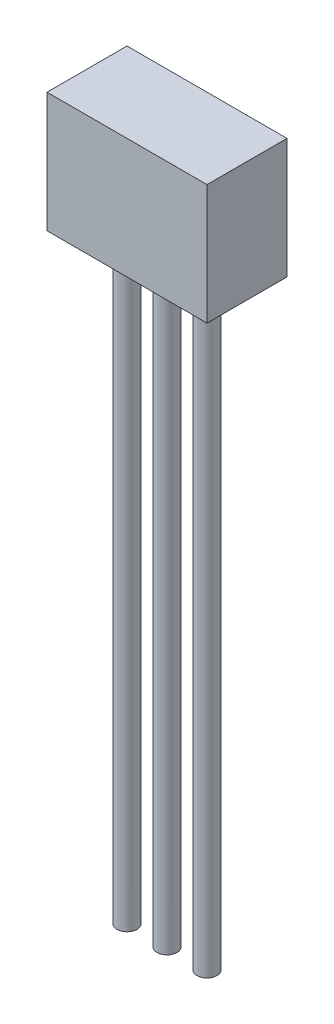
ISO-10303-21;
HEADER;
FILE_DESCRIPTION(('STEP AP214'),'2;1');
FILE_NAME('part.step','',(''),(''),'','','');
FILE_SCHEMA(('AUTOMOTIVE_DESIGN { 1 0 10303 214 1 1 1 1 }'));
ENDSEC;
DATA;
#1=APPLICATION_CONTEXT('core data for automotive mechanical design processes');
#2=APPLICATION_PROTOCOL_DEFINITION('international standard','automotive_design',2000,#1);
#3=PRODUCT_CONTEXT('',#1,'mechanical');
#4=PRODUCT('Part','Part','',(#3));
#5=PRODUCT_RELATED_PRODUCT_CATEGORY('part','',(#4));
#6=PRODUCT_DEFINITION_FORMATION('','',#4);
#7=PRODUCT_DEFINITION_CONTEXT('part definition',#1,'design');
#8=PRODUCT_DEFINITION('design','',#6,#7);
#9=PRODUCT_DEFINITION_SHAPE('','',#8);
#10=(LENGTH_UNIT() NAMED_UNIT(*) SI_UNIT(.MILLI.,.METRE.));
#11=(NAMED_UNIT(*) PLANE_ANGLE_UNIT() SI_UNIT($,.RADIAN.));
#12=(NAMED_UNIT(*) SI_UNIT($,.STERADIAN.) SOLID_ANGLE_UNIT());
#13=UNCERTAINTY_MEASURE_WITH_UNIT(LENGTH_MEASURE(1.E-05),#10,'distance_accuracy_value','');
#14=(GEOMETRIC_REPRESENTATION_CONTEXT(3) GLOBAL_UNCERTAINTY_ASSIGNED_CONTEXT((#13)) GLOBAL_UNIT_ASSIGNED_CONTEXT((#10,
#11,#12)) REPRESENTATION_CONTEXT('',''));
#15=CARTESIAN_POINT('',(0.,0.,0.));
#16=DIRECTION('',(0.,0.,1.));
#17=DIRECTION('',(1.,0.,0.));
#18=AXIS2_PLACEMENT_3D('',#15,#16,#17);
#19=CARTESIAN_POINT('',(2.,3.,0.));
#20=DIRECTION('',(-1.,0.,0.));
#21=DIRECTION('',(0.,0.,1.));
#22=AXIS2_PLACEMENT_3D('',#19,#20,#21);
#23=PLANE('',#22);
#24=DIRECTION('',(0.,0.,-1.));
#25=VECTOR('',#24,1.);
#26=CARTESIAN_POINT('',(2.,0.,0.));
#27=LINE('',#26,#25);
#28=CARTESIAN_POINT('',(2.,0.,1.));
#29=VERTEX_POINT('',#28);
#30=CARTESIAN_POINT('',(2.,0.,-1.));
#31=VERTEX_POINT('',#30);
#32=EDGE_CURVE('E81',#29,#31,#27,.T.);
#33=ORIENTED_EDGE('',*,*,#32,.T.);
#34=DIRECTION('',(0.,-1.,0.));
#35=VECTOR('',#34,1.);
#36=CARTESIAN_POINT('',(2.,3.,-1.));
#37=LINE('',#36,#35);
#38=CARTESIAN_POINT('',(2.,3.,-1.));
#39=VERTEX_POINT('',#38);
#40=EDGE_CURVE('E101',#39,#31,#37,.T.);
#41=ORIENTED_EDGE('',*,*,#40,.F.);
#42=DIRECTION('',(0.,0.,-1.));
#43=VECTOR('',#42,1.);
#44=CARTESIAN_POINT('',(2.,3.,0.));
#45=LINE('',#44,#43);
#46=CARTESIAN_POINT('',(2.,3.,1.));
#47=VERTEX_POINT('',#46);
#48=EDGE_CURVE('E86',#47,#39,#45,.T.);
#49=ORIENTED_EDGE('',*,*,#48,.F.);
#50=DIRECTION('',(0.,-1.,0.));
#51=VECTOR('',#50,1.);
#52=CARTESIAN_POINT('',(2.,3.,1.));
#53=LINE('',#52,#51);
#54=EDGE_CURVE('E106',#47,#29,#53,.T.);
#55=ORIENTED_EDGE('',*,*,#54,.T.);
#56=EDGE_LOOP('',(#33,#41,#49,#55));
#57=FACE_BOUND('',#56,.T.);
#58=ADVANCED_FACE('F42',(#57),#23,.F.);
#59=CARTESIAN_POINT('',(2.,3.,-1.));
#60=DIRECTION('',(0.,0.,1.));
#61=DIRECTION('',(1.,0.,0.));
#62=AXIS2_PLACEMENT_3D('',#59,#60,#61);
#63=PLANE('',#62);
#64=DIRECTION('',(-1.,0.,0.));
#65=VECTOR('',#64,1.);
#66=CARTESIAN_POINT('',(2.,0.,-1.));
#67=LINE('',#66,#65);
#68=CARTESIAN_POINT('',(-2.,0.,-1.));
#69=VERTEX_POINT('',#68);
#70=EDGE_CURVE('E100',#31,#69,#67,.T.);
#71=ORIENTED_EDGE('',*,*,#70,.T.);
#72=DIRECTION('',(0.,-1.,0.));
#73=VECTOR('',#72,1.);
#74=CARTESIAN_POINT('',(-2.,3.,-1.));
#75=LINE('',#74,#73);
#76=CARTESIAN_POINT('',(-2.,3.,-1.));
#77=VERTEX_POINT('',#76);
#78=EDGE_CURVE('E98',#77,#69,#75,.T.);
#79=ORIENTED_EDGE('',*,*,#78,.F.);
#80=DIRECTION('',(-1.,0.,0.));
#81=VECTOR('',#80,1.);
#82=CARTESIAN_POINT('',(2.,3.,-1.));
#83=LINE('',#82,#81);
#84=EDGE_CURVE('E89',#39,#77,#83,.T.);
#85=ORIENTED_EDGE('',*,*,#84,.F.);
#86=ORIENTED_EDGE('',*,*,#40,.T.);
#87=EDGE_LOOP('',(#71,#79,#85,#86));
#88=FACE_BOUND('',#87,.T.);
#89=ADVANCED_FACE('F99',(#88),#63,.F.);
#90=CARTESIAN_POINT('',(-2.,3.,0.));
#91=DIRECTION('',(1.,0.,0.));
#92=DIRECTION('',(0.,0.,-1.));
#93=AXIS2_PLACEMENT_3D('',#90,#91,#92);
#94=PLANE('',#93);
#95=DIRECTION('',(0.,0.,1.));
#96=VECTOR('',#95,1.);
#97=CARTESIAN_POINT('',(-2.,0.,0.));
#98=LINE('',#97,#96);
#99=CARTESIAN_POINT('',(-2.,0.,1.));
#100=VERTEX_POINT('',#99);
#101=EDGE_CURVE('E74',#69,#100,#98,.T.);
#102=ORIENTED_EDGE('',*,*,#101,.T.);
#103=DIRECTION('',(0.,-1.,0.));
#104=VECTOR('',#103,1.);
#105=CARTESIAN_POINT('',(-2.,3.,1.));
#106=LINE('',#105,#104);
#107=CARTESIAN_POINT('',(-2.,3.,1.));
#108=VERTEX_POINT('',#107);
#109=EDGE_CURVE('E102',#108,#100,#106,.T.);
#110=ORIENTED_EDGE('',*,*,#109,.F.);
#111=DIRECTION('',(0.,0.,1.));
#112=VECTOR('',#111,1.);
#113=CARTESIAN_POINT('',(-2.,3.,0.));
#114=LINE('',#113,#112);
#115=EDGE_CURVE('E93',#77,#108,#114,.T.);
#116=ORIENTED_EDGE('',*,*,#115,.F.);
#117=ORIENTED_EDGE('',*,*,#78,.T.);
#118=EDGE_LOOP('',(#102,#110,#116,#117));
#119=FACE_BOUND('',#118,.T.);
#120=ADVANCED_FACE('F104',(#119),#94,.F.);
#121=CARTESIAN_POINT('',(2.,3.,1.));
#122=DIRECTION('',(0.,0.,-1.));
#123=DIRECTION('',(-1.,0.,0.));
#124=AXIS2_PLACEMENT_3D('',#121,#122,#123);
#125=PLANE('',#124);
#126=DIRECTION('',(1.,0.,0.));
#127=VECTOR('',#126,1.);
#128=CARTESIAN_POINT('',(2.,0.,1.));
#129=LINE('',#128,#127);
#130=EDGE_CURVE('E114',#100,#29,#129,.T.);
#131=ORIENTED_EDGE('',*,*,#130,.T.);
#132=ORIENTED_EDGE('',*,*,#54,.F.);
#133=DIRECTION('',(1.,0.,0.));
#134=VECTOR('',#133,1.);
#135=CARTESIAN_POINT('',(2.,3.,1.));
#136=LINE('',#135,#134);
#137=EDGE_CURVE('E58',#108,#47,#136,.T.);
#138=ORIENTED_EDGE('',*,*,#137,.F.);
#139=ORIENTED_EDGE('',*,*,#109,.T.);
#140=EDGE_LOOP('',(#131,#132,#138,#139));
#141=FACE_BOUND('',#140,.T.);
#142=ADVANCED_FACE('F152',(#141),#125,.F.);
#143=CARTESIAN_POINT('',(0.,3.,0.));
#144=DIRECTION('',(0.,-1.,0.));
#145=DIRECTION('',(0.,0.,-1.));
#146=AXIS2_PLACEMENT_3D('',#143,#144,#145);
#147=PLANE('',#146);
#148=ORIENTED_EDGE('',*,*,#48,.T.);
#149=ORIENTED_EDGE('',*,*,#84,.T.);
#150=ORIENTED_EDGE('',*,*,#115,.T.);
#151=ORIENTED_EDGE('',*,*,#137,.T.);
#152=EDGE_LOOP('',(#148,#149,#150,#151));
#153=FACE_BOUND('',#152,.T.);
#154=ADVANCED_FACE('F91',(#153),#147,.F.);
#155=CARTESIAN_POINT('',(0.,0.,0.));
#156=DIRECTION('',(0.,-1.,0.));
#157=DIRECTION('',(0.,0.,-1.));
#158=AXIS2_PLACEMENT_3D('',#155,#156,#157);
#159=PLANE('',#158);
#160=CARTESIAN_POINT('',(0.,0.,0.));
#161=DIRECTION('',(0.,-1.,0.));
#162=DIRECTION('',(0.,0.,-1.));
#163=AXIS2_PLACEMENT_3D('',#160,#161,#162);
#164=CIRCLE('',#163,0.25);
#165=CARTESIAN_POINT('',(0.,0.,-0.25));
#166=VERTEX_POINT('',#165);
#167=EDGE_CURVE('E11',#166,#166,#164,.T.);
#168=ORIENTED_EDGE('',*,*,#167,.F.);
#169=EDGE_LOOP('',(#168));
#170=FACE_BOUND('',#169,.T.);
#171=CARTESIAN_POINT('',(1.,0.,0.));
#172=DIRECTION('',(0.,-1.,0.));
#173=DIRECTION('',(0.,0.,-1.));
#174=AXIS2_PLACEMENT_3D('',#171,#172,#173);
#175=CIRCLE('',#174,0.25);
#176=CARTESIAN_POINT('',(1.,0.,-0.25));
#177=VERTEX_POINT('',#176);
#178=EDGE_CURVE('E50',#177,#177,#175,.T.);
#179=ORIENTED_EDGE('',*,*,#178,.F.);
#180=EDGE_LOOP('',(#179));
#181=FACE_BOUND('',#180,.T.);
#182=CARTESIAN_POINT('',(-1.,0.,0.));
#183=DIRECTION('',(0.,-1.,0.));
#184=DIRECTION('',(0.,0.,-1.));
#185=AXIS2_PLACEMENT_3D('',#182,#183,#184);
#186=CIRCLE('',#185,0.25);
#187=CARTESIAN_POINT('',(-1.,0.,-0.25));
#188=VERTEX_POINT('',#187);
#189=EDGE_CURVE('E120',#188,#188,#186,.T.);
#190=ORIENTED_EDGE('',*,*,#189,.F.);
#191=EDGE_LOOP('',(#190));
#192=FACE_BOUND('',#191,.T.);
#193=ORIENTED_EDGE('',*,*,#32,.F.);
#194=ORIENTED_EDGE('',*,*,#130,.F.);
#195=ORIENTED_EDGE('',*,*,#101,.F.);
#196=ORIENTED_EDGE('',*,*,#70,.F.);
#197=EDGE_LOOP('',(#193,#194,#195,#196));
#198=FACE_BOUND('',#197,.T.);
#199=ADVANCED_FACE('F127',(#170,#181,#192,#198),#159,.T.);
#200=CARTESIAN_POINT('',(-1.,-15.,0.));
#201=DIRECTION('',(0.,1.,0.));
#202=DIRECTION('',(0.,0.,1.));
#203=AXIS2_PLACEMENT_3D('',#200,#201,#202);
#204=CYLINDRICAL_SURFACE('',#203,0.25);
#205=CARTESIAN_POINT('',(-1.,-15.,0.));
#206=DIRECTION('',(0.,1.,0.));
#207=DIRECTION('',(0.,0.,1.));
#208=AXIS2_PLACEMENT_3D('',#205,#206,#207);
#209=CIRCLE('',#208,0.25);
#210=CARTESIAN_POINT('',(-1.,-15.,0.25));
#211=VERTEX_POINT('',#210);
#212=EDGE_CURVE('E111',#211,#211,#209,.T.);
#213=ORIENTED_EDGE('',*,*,#212,.T.);
#214=EDGE_LOOP('',(#213));
#215=FACE_BOUND('',#214,.T.);
#216=ORIENTED_EDGE('',*,*,#189,.T.);
#217=EDGE_LOOP('',(#216));
#218=FACE_BOUND('',#217,.T.);
#219=ADVANCED_FACE('F130',(#215,#218),#204,.T.);
#220=CARTESIAN_POINT('',(-1.,-15.,0.));
#221=DIRECTION('',(0.,1.,0.));
#222=DIRECTION('',(0.,0.,1.));
#223=AXIS2_PLACEMENT_3D('',#220,#221,#222);
#224=PLANE('',#223);
#225=ORIENTED_EDGE('',*,*,#212,.F.);
#226=EDGE_LOOP('',(#225));
#227=FACE_BOUND('',#226,.T.);
#228=ADVANCED_FACE('F136',(#227),#224,.F.);
#229=CARTESIAN_POINT('',(1.,-15.,0.));
#230=DIRECTION('',(0.,1.,0.));
#231=DIRECTION('',(0.,0.,1.));
#232=AXIS2_PLACEMENT_3D('',#229,#230,#231);
#233=CYLINDRICAL_SURFACE('',#232,0.25);
#234=CARTESIAN_POINT('',(1.,-15.,0.));
#235=DIRECTION('',(0.,1.,0.));
#236=DIRECTION('',(0.,0.,1.));
#237=AXIS2_PLACEMENT_3D('',#234,#235,#236);
#238=CIRCLE('',#237,0.25);
#239=CARTESIAN_POINT('',(1.,-15.,0.25));
#240=VERTEX_POINT('',#239);
#241=EDGE_CURVE('E155',#240,#240,#238,.T.);
#242=ORIENTED_EDGE('',*,*,#241,.T.);
#243=EDGE_LOOP('',(#242));
#244=FACE_BOUND('',#243,.T.);
#245=ORIENTED_EDGE('',*,*,#178,.T.);
#246=EDGE_LOOP('',(#245));
#247=FACE_BOUND('',#246,.T.);
#248=ADVANCED_FACE('F125',(#244,#247),#233,.T.);
#249=CARTESIAN_POINT('',(1.,-15.,0.));
#250=DIRECTION('',(0.,1.,0.));
#251=DIRECTION('',(0.,0.,1.));
#252=AXIS2_PLACEMENT_3D('',#249,#250,#251);
#253=PLANE('',#252);
#254=ORIENTED_EDGE('',*,*,#241,.F.);
#255=EDGE_LOOP('',(#254));
#256=FACE_BOUND('',#255,.T.);
#257=ADVANCED_FACE('F171',(#256),#253,.F.);
#258=CARTESIAN_POINT('',(0.,-15.,0.));
#259=DIRECTION('',(0.,1.,0.));
#260=DIRECTION('',(0.,0.,1.));
#261=AXIS2_PLACEMENT_3D('',#258,#259,#260);
#262=CYLINDRICAL_SURFACE('',#261,0.25);
#263=CARTESIAN_POINT('',(0.,-15.,0.));
#264=DIRECTION('',(0.,1.,0.));
#265=DIRECTION('',(0.,0.,1.));
#266=AXIS2_PLACEMENT_3D('',#263,#264,#265);
#267=CIRCLE('',#266,0.25);
#268=CARTESIAN_POINT('',(0.,-15.,0.25));
#269=VERTEX_POINT('',#268);
#270=EDGE_CURVE('E158',#269,#269,#267,.T.);
#271=ORIENTED_EDGE('',*,*,#270,.T.);
#272=EDGE_LOOP('',(#271));
#273=FACE_BOUND('',#272,.T.);
#274=ORIENTED_EDGE('',*,*,#167,.T.);
#275=EDGE_LOOP('',(#274));
#276=FACE_BOUND('',#275,.T.);
#277=ADVANCED_FACE('F162',(#273,#276),#262,.T.);
#278=CARTESIAN_POINT('',(0.,-15.,0.));
#279=DIRECTION('',(0.,1.,0.));
#280=DIRECTION('',(0.,0.,1.));
#281=AXIS2_PLACEMENT_3D('',#278,#279,#280);
#282=PLANE('',#281);
#283=ORIENTED_EDGE('',*,*,#270,.F.);
#284=EDGE_LOOP('',(#283));
#285=FACE_BOUND('',#284,.T.);
#286=ADVANCED_FACE('F165',(#285),#282,.F.);
#287=CLOSED_SHELL('',(#58,#89,#120,#142,#154,#199,#219,#228,#248,#257,#277,#286));
#288=MANIFOLD_SOLID_BREP('B2',#287);
#289=ADVANCED_BREP_SHAPE_REPRESENTATION('',(#18,#288),#14);
#290=SHAPE_DEFINITION_REPRESENTATION(#9,#289);
ENDSEC;
END-ISO-10303-21;
